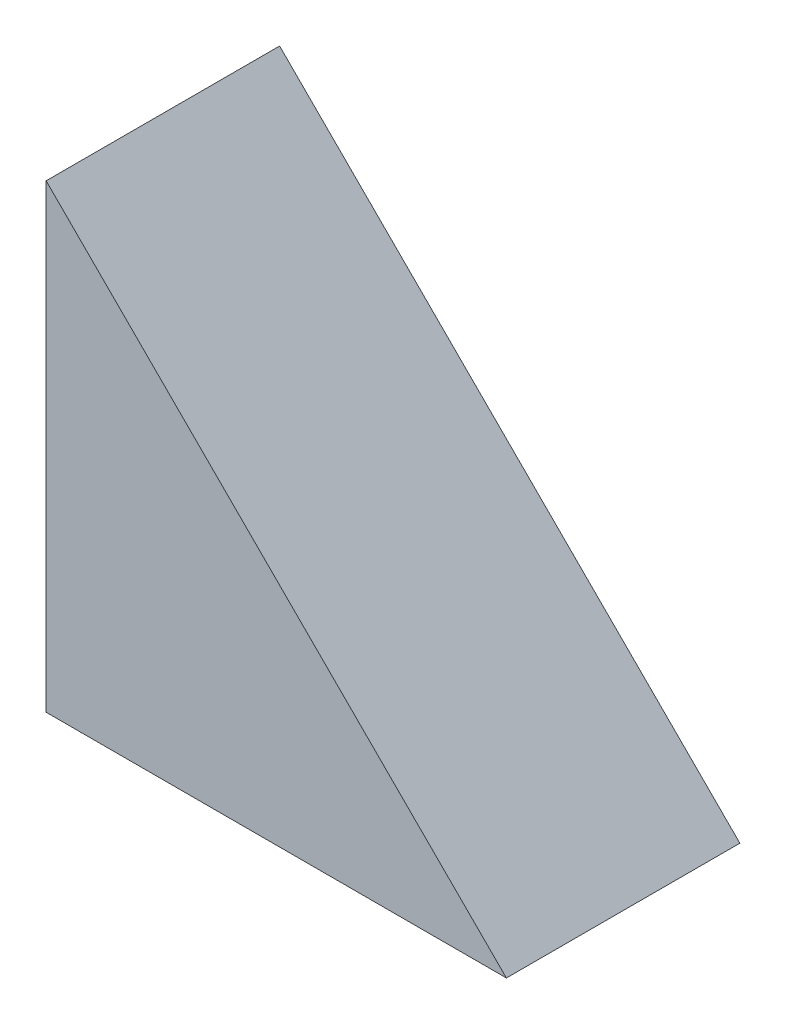
ISO-10303-21;
HEADER;
FILE_DESCRIPTION(('STEP AP214'),'2;1');
FILE_NAME('part.step','',(''),(''),'','','');
FILE_SCHEMA(('AUTOMOTIVE_DESIGN { 1 0 10303 214 1 1 1 1 }'));
ENDSEC;
DATA;
#1=APPLICATION_CONTEXT('core data for automotive mechanical design processes');
#2=APPLICATION_PROTOCOL_DEFINITION('international standard','automotive_design',2000,#1);
#3=PRODUCT_CONTEXT('',#1,'mechanical');
#4=PRODUCT('Part','Part','',(#3));
#5=PRODUCT_RELATED_PRODUCT_CATEGORY('part','',(#4));
#6=PRODUCT_DEFINITION_FORMATION('','',#4);
#7=PRODUCT_DEFINITION_CONTEXT('part definition',#1,'design');
#8=PRODUCT_DEFINITION('design','',#6,#7);
#9=PRODUCT_DEFINITION_SHAPE('','',#8);
#10=(LENGTH_UNIT() NAMED_UNIT(*) SI_UNIT(.MILLI.,.METRE.));
#11=(NAMED_UNIT(*) PLANE_ANGLE_UNIT() SI_UNIT($,.RADIAN.));
#12=(NAMED_UNIT(*) SI_UNIT($,.STERADIAN.) SOLID_ANGLE_UNIT());
#13=UNCERTAINTY_MEASURE_WITH_UNIT(LENGTH_MEASURE(1.E-05),#10,'distance_accuracy_value','');
#14=(GEOMETRIC_REPRESENTATION_CONTEXT(3) GLOBAL_UNCERTAINTY_ASSIGNED_CONTEXT((#13)) GLOBAL_UNIT_ASSIGNED_CONTEXT((#10,
#11,#12)) REPRESENTATION_CONTEXT('',''));
#15=CARTESIAN_POINT('',(0.,0.,0.));
#16=DIRECTION('',(0.,0.,1.));
#17=DIRECTION('',(1.,0.,0.));
#18=AXIS2_PLACEMENT_3D('',#15,#16,#17);
#19=CARTESIAN_POINT('',(0.,69.,35.));
#20=DIRECTION('',(1.,0.,0.));
#21=DIRECTION('',(0.,1.,0.));
#22=AXIS2_PLACEMENT_3D('',#19,#20,#21);
#23=PLANE('',#22);
#24=DIRECTION('',(0.,-1.,0.));
#25=VECTOR('',#24,1.);
#26=CARTESIAN_POINT('',(0.,69.,0.));
#27=LINE('',#26,#25);
#28=CARTESIAN_POINT('',(0.,69.,0.));
#29=VERTEX_POINT('',#28);
#30=CARTESIAN_POINT('',(0.,0.,0.));
#31=VERTEX_POINT('',#30);
#32=EDGE_CURVE('E79',#29,#31,#27,.T.);
#33=ORIENTED_EDGE('',*,*,#32,.T.);
#34=DIRECTION('',(0.,0.,-1.));
#35=VECTOR('',#34,1.);
#36=CARTESIAN_POINT('',(0.,0.,35.));
#37=LINE('',#36,#35);
#38=CARTESIAN_POINT('',(0.,0.,35.));
#39=VERTEX_POINT('',#38);
#40=EDGE_CURVE('E11',#39,#31,#37,.T.);
#41=ORIENTED_EDGE('',*,*,#40,.F.);
#42=DIRECTION('',(0.,-1.,0.));
#43=VECTOR('',#42,1.);
#44=CARTESIAN_POINT('',(0.,69.,35.));
#45=LINE('',#44,#43);
#46=CARTESIAN_POINT('',(0.,69.,35.));
#47=VERTEX_POINT('',#46);
#48=EDGE_CURVE('E72',#47,#39,#45,.T.);
#49=ORIENTED_EDGE('',*,*,#48,.F.);
#50=DIRECTION('',(0.,0.,-1.));
#51=VECTOR('',#50,1.);
#52=CARTESIAN_POINT('',(0.,69.,35.));
#53=LINE('',#52,#51);
#54=EDGE_CURVE('E80',#47,#29,#53,.T.);
#55=ORIENTED_EDGE('',*,*,#54,.T.);
#56=EDGE_LOOP('',(#33,#41,#49,#55));
#57=FACE_BOUND('',#56,.T.);
#58=ADVANCED_FACE('F32',(#57),#23,.F.);
#59=CARTESIAN_POINT('',(0.,0.,35.));
#60=DIRECTION('',(0.,1.,0.));
#61=DIRECTION('',(0.,0.,1.));
#62=AXIS2_PLACEMENT_3D('',#59,#60,#61);
#63=PLANE('',#62);
#64=DIRECTION('',(1.,0.,0.));
#65=VECTOR('',#64,1.);
#66=CARTESIAN_POINT('',(0.,0.,0.));
#67=LINE('',#66,#65);
#68=CARTESIAN_POINT('',(69.,0.,0.));
#69=VERTEX_POINT('',#68);
#70=EDGE_CURVE('E60',#31,#69,#67,.T.);
#71=ORIENTED_EDGE('',*,*,#70,.T.);
#72=DIRECTION('',(0.,0.,-1.));
#73=VECTOR('',#72,1.);
#74=CARTESIAN_POINT('',(69.,0.,35.));
#75=LINE('',#74,#73);
#76=CARTESIAN_POINT('',(69.,0.,35.));
#77=VERTEX_POINT('',#76);
#78=EDGE_CURVE('E40',#77,#69,#75,.T.);
#79=ORIENTED_EDGE('',*,*,#78,.F.);
#80=DIRECTION('',(1.,0.,0.));
#81=VECTOR('',#80,1.);
#82=CARTESIAN_POINT('',(0.,0.,35.));
#83=LINE('',#82,#81);
#84=EDGE_CURVE('E68',#39,#77,#83,.T.);
#85=ORIENTED_EDGE('',*,*,#84,.F.);
#86=ORIENTED_EDGE('',*,*,#40,.T.);
#87=EDGE_LOOP('',(#71,#79,#85,#86));
#88=FACE_BOUND('',#87,.T.);
#89=ADVANCED_FACE('F69',(#88),#63,.F.);
#90=CARTESIAN_POINT('',(69.,0.,35.));
#91=DIRECTION('',(-0.707106781186548,-0.707106781186548,0.));
#92=DIRECTION('',(0.707106781186548,-0.707106781186548,0.));
#93=AXIS2_PLACEMENT_3D('',#90,#91,#92);
#94=PLANE('',#93);
#95=DIRECTION('',(-0.707106781186548,0.707106781186548,0.));
#96=VECTOR('',#95,1.);
#97=CARTESIAN_POINT('',(69.,0.,0.));
#98=LINE('',#97,#96);
#99=EDGE_CURVE('E65',#69,#29,#98,.T.);
#100=ORIENTED_EDGE('',*,*,#99,.T.);
#101=ORIENTED_EDGE('',*,*,#54,.F.);
#102=DIRECTION('',(-0.707106781186548,0.707106781186548,0.));
#103=VECTOR('',#102,1.);
#104=CARTESIAN_POINT('',(69.,0.,35.));
#105=LINE('',#104,#103);
#106=EDGE_CURVE('E48',#77,#47,#105,.T.);
#107=ORIENTED_EDGE('',*,*,#106,.F.);
#108=ORIENTED_EDGE('',*,*,#78,.T.);
#109=EDGE_LOOP('',(#100,#101,#107,#108));
#110=FACE_BOUND('',#109,.T.);
#111=ADVANCED_FACE('F87',(#110),#94,.F.);
#112=CARTESIAN_POINT('',(0.,0.,35.));
#113=DIRECTION('',(0.,0.,1.));
#114=DIRECTION('',(1.,0.,0.));
#115=AXIS2_PLACEMENT_3D('',#112,#113,#114);
#116=PLANE('',#115);
#117=ORIENTED_EDGE('',*,*,#48,.T.);
#118=ORIENTED_EDGE('',*,*,#84,.T.);
#119=ORIENTED_EDGE('',*,*,#106,.T.);
#120=EDGE_LOOP('',(#117,#118,#119));
#121=FACE_BOUND('',#120,.T.);
#122=ADVANCED_FACE('F75',(#121),#116,.T.);
#123=CARTESIAN_POINT('',(0.,0.,0.));
#124=DIRECTION('',(0.,0.,1.));
#125=DIRECTION('',(1.,0.,0.));
#126=AXIS2_PLACEMENT_3D('',#123,#124,#125);
#127=PLANE('',#126);
#128=ORIENTED_EDGE('',*,*,#32,.F.);
#129=ORIENTED_EDGE('',*,*,#99,.F.);
#130=ORIENTED_EDGE('',*,*,#70,.F.);
#131=EDGE_LOOP('',(#128,#129,#130));
#132=FACE_BOUND('',#131,.T.);
#133=ADVANCED_FACE('F88',(#132),#127,.F.);
#134=CLOSED_SHELL('',(#58,#89,#111,#122,#133));
#135=MANIFOLD_SOLID_BREP('B2',#134);
#136=ADVANCED_BREP_SHAPE_REPRESENTATION('',(#18,#135),#14);
#137=SHAPE_DEFINITION_REPRESENTATION(#9,#136);
ENDSEC;
END-ISO-10303-21;
